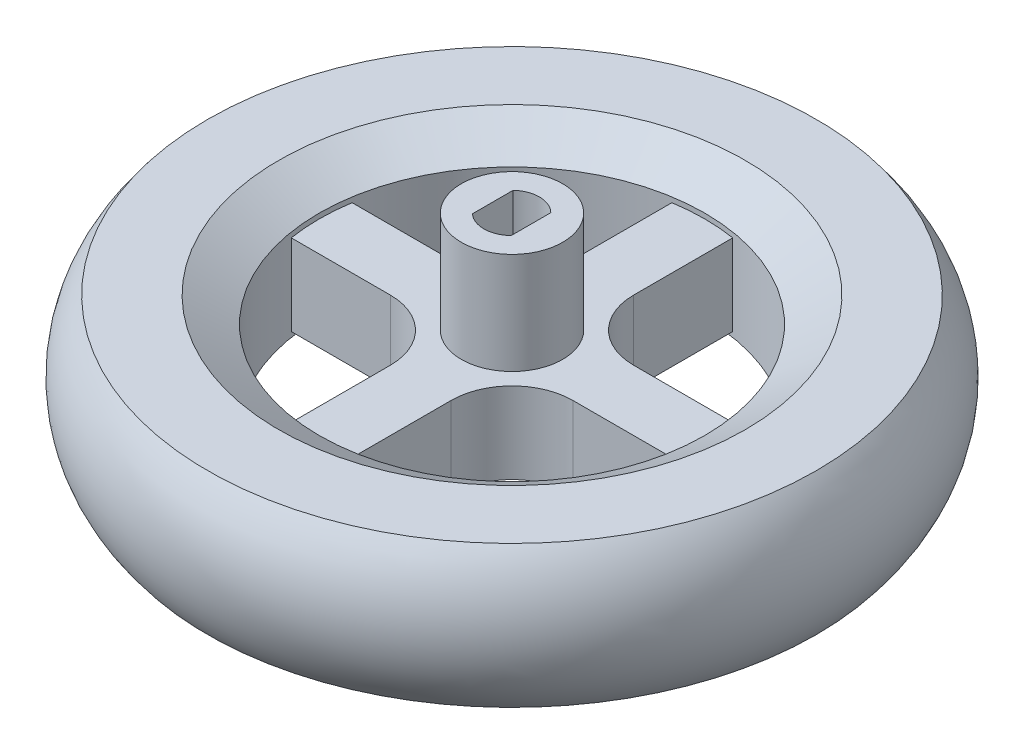
ISO-10303-21;
HEADER;
FILE_DESCRIPTION(('STEP AP214'),'2;1');
FILE_NAME('part.step','',(''),(''),'','','');
FILE_SCHEMA(('AUTOMOTIVE_DESIGN { 1 0 10303 214 1 1 1 1 }'));
ENDSEC;
DATA;
#1=APPLICATION_CONTEXT('core data for automotive mechanical design processes');
#2=APPLICATION_PROTOCOL_DEFINITION('international standard','automotive_design',2000,#1);
#3=PRODUCT_CONTEXT('',#1,'mechanical');
#4=PRODUCT('Part','Part','',(#3));
#5=PRODUCT_RELATED_PRODUCT_CATEGORY('part','',(#4));
#6=PRODUCT_DEFINITION_FORMATION('','',#4);
#7=PRODUCT_DEFINITION_CONTEXT('part definition',#1,'design');
#8=PRODUCT_DEFINITION('design','',#6,#7);
#9=PRODUCT_DEFINITION_SHAPE('','',#8);
#10=(LENGTH_UNIT() NAMED_UNIT(*) SI_UNIT(.MILLI.,.METRE.));
#11=(NAMED_UNIT(*) PLANE_ANGLE_UNIT() SI_UNIT($,.RADIAN.));
#12=(NAMED_UNIT(*) SI_UNIT($,.STERADIAN.) SOLID_ANGLE_UNIT());
#13=UNCERTAINTY_MEASURE_WITH_UNIT(LENGTH_MEASURE(1.E-05),#10,'distance_accuracy_value','');
#14=(GEOMETRIC_REPRESENTATION_CONTEXT(3) GLOBAL_UNCERTAINTY_ASSIGNED_CONTEXT((#13)) GLOBAL_UNIT_ASSIGNED_CONTEXT((#10,
#11,#12)) REPRESENTATION_CONTEXT('',''));
#15=CARTESIAN_POINT('',(0.,0.,0.));
#16=DIRECTION('',(0.,0.,1.));
#17=DIRECTION('',(1.,0.,0.));
#18=AXIS2_PLACEMENT_3D('',#15,#16,#17);
#19=CARTESIAN_POINT('',(0.,-7.,0.));
#20=DIRECTION('',(0.,-1.,0.));
#21=DIRECTION('',(1.,0.,0.));
#22=AXIS2_PLACEMENT_3D('',#19,#20,#21);
#23=CYLINDRICAL_SURFACE('',#22,19.);
#24=CARTESIAN_POINT('',(0.,-4.,0.));
#25=DIRECTION('',(0.,1.,0.));
#26=DIRECTION('',(-1.,0.,0.));
#27=AXIS2_PLACEMENT_3D('',#24,#25,#26);
#28=CIRCLE('',#27,19.);
#29=CARTESIAN_POINT('',(18.7616630392937,-4.,-3.));
#30=VERTEX_POINT('',#29);
#31=CARTESIAN_POINT('',(18.7616630392937,-4.,3.));
#32=VERTEX_POINT('',#31);
#33=EDGE_CURVE('E57',#30,#32,#28,.F.);
#34=ORIENTED_EDGE('',*,*,#33,.F.);
#35=DIRECTION('',(0.,-1.,0.));
#36=VECTOR('',#35,1.);
#37=CARTESIAN_POINT('',(18.7616630392937,-7.,-3.));
#38=LINE('',#37,#36);
#39=CARTESIAN_POINT('',(18.7616630392937,4.,-3.));
#40=VERTEX_POINT('',#39);
#41=EDGE_CURVE('E348',#30,#40,#38,.F.);
#42=ORIENTED_EDGE('',*,*,#41,.T.);
#43=CARTESIAN_POINT('',(0.,4.,0.));
#44=DIRECTION('',(0.,1.,0.));
#45=DIRECTION('',(-1.,0.,0.));
#46=AXIS2_PLACEMENT_3D('',#43,#44,#45);
#47=CIRCLE('',#46,19.);
#48=CARTESIAN_POINT('',(18.7616630392937,4.,3.));
#49=VERTEX_POINT('',#48);
#50=EDGE_CURVE('E349',#40,#49,#47,.F.);
#51=ORIENTED_EDGE('',*,*,#50,.T.);
#52=DIRECTION('',(0.,-1.,0.));
#53=VECTOR('',#52,1.);
#54=CARTESIAN_POINT('',(18.7616630392937,-7.,3.));
#55=LINE('',#54,#53);
#56=EDGE_CURVE('E345',#49,#32,#55,.T.);
#57=ORIENTED_EDGE('',*,*,#56,.T.);
#58=EDGE_LOOP('',(#34,#42,#51,#57));
#59=FACE_BOUND('',#58,.T.);
#60=CARTESIAN_POINT('',(-18.7616630392937,-4.,3.));
#61=VERTEX_POINT('',#60);
#62=CARTESIAN_POINT('',(-18.7616630392937,-4.,-3.));
#63=VERTEX_POINT('',#62);
#64=EDGE_CURVE('E58',#61,#63,#28,.F.);
#65=ORIENTED_EDGE('',*,*,#64,.F.);
#66=DIRECTION('',(0.,-1.,0.));
#67=VECTOR('',#66,1.);
#68=CARTESIAN_POINT('',(-18.7616630392937,-7.,3.));
#69=LINE('',#68,#67);
#70=CARTESIAN_POINT('',(-18.7616630392937,4.,3.));
#71=VERTEX_POINT('',#70);
#72=EDGE_CURVE('E335',#61,#71,#69,.F.);
#73=ORIENTED_EDGE('',*,*,#72,.T.);
#74=CARTESIAN_POINT('',(-18.7616630392937,4.,-3.));
#75=VERTEX_POINT('',#74);
#76=EDGE_CURVE('E327',#71,#75,#47,.F.);
#77=ORIENTED_EDGE('',*,*,#76,.T.);
#78=DIRECTION('',(0.,-1.,0.));
#79=VECTOR('',#78,1.);
#80=CARTESIAN_POINT('',(-18.7616630392937,-7.,-3.));
#81=LINE('',#80,#79);
#82=EDGE_CURVE('E330',#75,#63,#81,.T.);
#83=ORIENTED_EDGE('',*,*,#82,.T.);
#84=EDGE_LOOP('',(#65,#73,#77,#83));
#85=FACE_BOUND('',#84,.T.);
#86=CARTESIAN_POINT('',(0.,4.5,0.));
#87=DIRECTION('',(0.,-1.,0.));
#88=DIRECTION('',(1.,0.,0.));
#89=AXIS2_PLACEMENT_3D('',#86,#87,#88);
#90=CIRCLE('',#89,19.);
#91=CARTESIAN_POINT('',(19.,4.5,0.));
#92=VERTEX_POINT('',#91);
#93=EDGE_CURVE('E321',#92,#92,#90,.T.);
#94=ORIENTED_EDGE('',*,*,#93,.F.);
#95=EDGE_LOOP('',(#94));
#96=FACE_BOUND('',#95,.T.);
#97=CARTESIAN_POINT('',(0.,-4.5,0.));
#98=DIRECTION('',(0.,-1.,0.));
#99=DIRECTION('',(1.,0.,0.));
#100=AXIS2_PLACEMENT_3D('',#97,#98,#99);
#101=CIRCLE('',#100,19.);
#102=CARTESIAN_POINT('',(19.,-4.5,0.));
#103=VERTEX_POINT('',#102);
#104=EDGE_CURVE('E318',#103,#103,#101,.T.);
#105=ORIENTED_EDGE('',*,*,#104,.T.);
#106=EDGE_LOOP('',(#105));
#107=FACE_BOUND('',#106,.T.);
#108=CARTESIAN_POINT('',(3.,-4.,18.7616630392937));
#109=VERTEX_POINT('',#108);
#110=CARTESIAN_POINT('',(-3.,-4.,18.7616630392937));
#111=VERTEX_POINT('',#110);
#112=EDGE_CURVE('E338',#109,#111,#28,.F.);
#113=ORIENTED_EDGE('',*,*,#112,.F.);
#114=DIRECTION('',(0.,-1.,0.));
#115=VECTOR('',#114,1.);
#116=CARTESIAN_POINT('',(3.,-7.,18.7616630392937));
#117=LINE('',#116,#115);
#118=CARTESIAN_POINT('',(3.,4.,18.7616630392937));
#119=VERTEX_POINT('',#118);
#120=EDGE_CURVE('E342',#109,#119,#117,.F.);
#121=ORIENTED_EDGE('',*,*,#120,.T.);
#122=CARTESIAN_POINT('',(-3.,4.,18.7616630392937));
#123=VERTEX_POINT('',#122);
#124=EDGE_CURVE('E332',#119,#123,#47,.F.);
#125=ORIENTED_EDGE('',*,*,#124,.T.);
#126=DIRECTION('',(0.,-1.,0.));
#127=VECTOR('',#126,1.);
#128=CARTESIAN_POINT('',(-3.,-7.,18.7616630392937));
#129=LINE('',#128,#127);
#130=EDGE_CURVE('E339',#123,#111,#129,.T.);
#131=ORIENTED_EDGE('',*,*,#130,.T.);
#132=EDGE_LOOP('',(#113,#121,#125,#131));
#133=FACE_BOUND('',#132,.T.);
#134=CARTESIAN_POINT('',(-3.,-4.,-18.7616630392937));
#135=VERTEX_POINT('',#134);
#136=CARTESIAN_POINT('',(3.,-4.,-18.7616630392937));
#137=VERTEX_POINT('',#136);
#138=EDGE_CURVE('E11',#135,#137,#28,.F.);
#139=ORIENTED_EDGE('',*,*,#138,.F.);
#140=DIRECTION('',(0.,-1.,0.));
#141=VECTOR('',#140,1.);
#142=CARTESIAN_POINT('',(-3.,-7.,-18.7616630392937));
#143=LINE('',#142,#141);
#144=CARTESIAN_POINT('',(-3.,4.,-18.7616630392937));
#145=VERTEX_POINT('',#144);
#146=EDGE_CURVE('E351',#135,#145,#143,.F.);
#147=ORIENTED_EDGE('',*,*,#146,.T.);
#148=CARTESIAN_POINT('',(3.,4.,-18.7616630392937));
#149=VERTEX_POINT('',#148);
#150=EDGE_CURVE('E331',#145,#149,#47,.F.);
#151=ORIENTED_EDGE('',*,*,#150,.T.);
#152=DIRECTION('',(0.,-1.,0.));
#153=VECTOR('',#152,1.);
#154=CARTESIAN_POINT('',(3.,-7.,-18.7616630392937));
#155=LINE('',#154,#153);
#156=EDGE_CURVE('E51',#149,#137,#155,.T.);
#157=ORIENTED_EDGE('',*,*,#156,.T.);
#158=EDGE_LOOP('',(#139,#147,#151,#157));
#159=FACE_BOUND('',#158,.T.);
#160=ADVANCED_FACE('F47',(#59,#85,#96,#107,#133,#159),#23,.F.);
#161=CARTESIAN_POINT('',(-23.,7.00000000000001,0.));
#162=DIRECTION('',(0.,-1.,0.));
#163=DIRECTION('',(1.,0.,0.));
#164=AXIS2_PLACEMENT_3D('',#161,#162,#163);
#165=PLANE('',#164);
#166=CARTESIAN_POINT('',(0.,7.00000000000001,0.));
#167=DIRECTION('',(0.,-1.,0.));
#168=DIRECTION('',(1.,0.,0.));
#169=AXIS2_PLACEMENT_3D('',#166,#167,#168);
#170=CIRCLE('',#169,30.);
#171=CARTESIAN_POINT('',(30.,7.00000000000001,0.));
#172=VERTEX_POINT('',#171);
#173=EDGE_CURVE('E292',#172,#172,#170,.T.);
#174=ORIENTED_EDGE('',*,*,#173,.F.);
#175=EDGE_LOOP('',(#174));
#176=FACE_BOUND('',#175,.T.);
#177=CARTESIAN_POINT('',(0.,7.00000000000001,0.));
#178=DIRECTION('',(0.,-1.,0.));
#179=DIRECTION('',(1.,0.,0.));
#180=AXIS2_PLACEMENT_3D('',#177,#178,#179);
#181=CIRCLE('',#180,23.);
#182=CARTESIAN_POINT('',(23.,7.00000000000002,0.));
#183=VERTEX_POINT('',#182);
#184=EDGE_CURVE('E324',#183,#183,#181,.T.);
#185=ORIENTED_EDGE('',*,*,#184,.T.);
#186=EDGE_LOOP('',(#185));
#187=FACE_BOUND('',#186,.T.);
#188=ADVANCED_FACE('F49',(#176,#187),#165,.F.);
#189=CARTESIAN_POINT('',(0.,4.5,0.));
#190=DIRECTION('',(0.,1.,0.));
#191=DIRECTION('',(-1.,0.,0.));
#192=AXIS2_PLACEMENT_3D('',#189,#190,#191);
#193=CONICAL_SURFACE('',#192,19.,1.01219701145133);
#194=ORIENTED_EDGE('',*,*,#184,.F.);
#195=EDGE_LOOP('',(#194));
#196=FACE_BOUND('',#195,.T.);
#197=ORIENTED_EDGE('',*,*,#93,.T.);
#198=EDGE_LOOP('',(#197));
#199=FACE_BOUND('',#198,.T.);
#200=ADVANCED_FACE('F437',(#196,#199),#193,.F.);
#201=CARTESIAN_POINT('',(0.,-6.99999999999999,0.));
#202=DIRECTION('',(0.,-1.,0.));
#203=DIRECTION('',(1.,0.,0.));
#204=AXIS2_PLACEMENT_3D('',#201,#202,#203);
#205=CONICAL_SURFACE('',#204,23.,1.01219701145134);
#206=ORIENTED_EDGE('',*,*,#104,.F.);
#207=EDGE_LOOP('',(#206));
#208=FACE_BOUND('',#207,.T.);
#209=CARTESIAN_POINT('',(0.,-6.99999999999999,0.));
#210=DIRECTION('',(0.,-1.,0.));
#211=DIRECTION('',(1.,0.,0.));
#212=AXIS2_PLACEMENT_3D('',#209,#210,#211);
#213=CIRCLE('',#212,23.);
#214=CARTESIAN_POINT('',(23.,-6.99999999999998,0.));
#215=VERTEX_POINT('',#214);
#216=EDGE_CURVE('E315',#215,#215,#213,.T.);
#217=ORIENTED_EDGE('',*,*,#216,.T.);
#218=EDGE_LOOP('',(#217));
#219=FACE_BOUND('',#218,.T.);
#220=ADVANCED_FACE('F440',(#208,#219),#205,.F.);
#221=CARTESIAN_POINT('',(-23.,-6.99999999999999,0.));
#222=DIRECTION('',(0.,1.,0.));
#223=DIRECTION('',(-1.,0.,0.));
#224=AXIS2_PLACEMENT_3D('',#221,#222,#223);
#225=PLANE('',#224);
#226=ORIENTED_EDGE('',*,*,#216,.F.);
#227=EDGE_LOOP('',(#226));
#228=FACE_BOUND('',#227,.T.);
#229=CARTESIAN_POINT('',(0.,-6.99999999999998,0.));
#230=DIRECTION('',(0.,-1.,0.));
#231=DIRECTION('',(1.,0.,0.));
#232=AXIS2_PLACEMENT_3D('',#229,#230,#231);
#233=CIRCLE('',#232,30.);
#234=CARTESIAN_POINT('',(30.,-6.99999999999998,0.));
#235=VERTEX_POINT('',#234);
#236=EDGE_CURVE('E312',#235,#235,#233,.T.);
#237=ORIENTED_EDGE('',*,*,#236,.T.);
#238=EDGE_LOOP('',(#237));
#239=FACE_BOUND('',#238,.T.);
#240=ADVANCED_FACE('F447',(#228,#239),#225,.F.);
#241=CARTESIAN_POINT('',(0.,0.,0.));
#242=DIRECTION('',(0.,-1.,0.));
#243=DIRECTION('',(1.,0.,0.));
#244=AXIS2_PLACEMENT_3D('',#241,#242,#243);
#245=TOROIDAL_SURFACE('',#244,21.45,11.05);
#246=ORIENTED_EDGE('',*,*,#236,.F.);
#247=EDGE_LOOP('',(#246));
#248=FACE_BOUND('',#247,.T.);
#249=ORIENTED_EDGE('',*,*,#173,.T.);
#250=EDGE_LOOP('',(#249));
#251=FACE_BOUND('',#250,.T.);
#252=ADVANCED_FACE('F459',(#248,#251),#245,.T.);
#253=CARTESIAN_POINT('',(3.,-4.,-9.));
#254=DIRECTION('',(1.,0.,0.));
#255=DIRECTION('',(0.,1.,0.));
#256=AXIS2_PLACEMENT_3D('',#253,#254,#255);
#257=PLANE('',#256);
#258=ORIENTED_EDGE('',*,*,#156,.F.);
#259=DIRECTION('',(0.,0.,-1.));
#260=VECTOR('',#259,1.);
#261=CARTESIAN_POINT('',(3.,4.,-9.));
#262=LINE('',#261,#260);
#263=CARTESIAN_POINT('',(3.,4.,-9.));
#264=VERTEX_POINT('',#263);
#265=EDGE_CURVE('E73',#264,#149,#262,.T.);
#266=ORIENTED_EDGE('',*,*,#265,.F.);
#267=DIRECTION('',(0.,1.,0.));
#268=VECTOR('',#267,1.);
#269=CARTESIAN_POINT('',(3.,-4.,-9.));
#270=LINE('',#269,#268);
#271=CARTESIAN_POINT('',(3.,-4.,-9.));
#272=VERTEX_POINT('',#271);
#273=EDGE_CURVE('E290',#272,#264,#270,.T.);
#274=ORIENTED_EDGE('',*,*,#273,.F.);
#275=DIRECTION('',(0.,0.,-1.));
#276=VECTOR('',#275,1.);
#277=CARTESIAN_POINT('',(3.,-4.,-9.));
#278=LINE('',#277,#276);
#279=EDGE_CURVE('E257',#272,#137,#278,.T.);
#280=ORIENTED_EDGE('',*,*,#279,.T.);
#281=EDGE_LOOP('',(#258,#266,#274,#280));
#282=FACE_BOUND('',#281,.T.);
#283=ADVANCED_FACE('F395',(#282),#257,.T.);
#284=CARTESIAN_POINT('',(9.,-4.,-3.));
#285=DIRECTION('',(0.,0.,-1.));
#286=DIRECTION('',(-1.,0.,0.));
#287=AXIS2_PLACEMENT_3D('',#284,#285,#286);
#288=PLANE('',#287);
#289=ORIENTED_EDGE('',*,*,#41,.F.);
#290=DIRECTION('',(-1.,0.,0.));
#291=VECTOR('',#290,1.);
#292=CARTESIAN_POINT('',(9.,-4.,-3.));
#293=LINE('',#292,#291);
#294=CARTESIAN_POINT('',(9.,-4.,-3.));
#295=VERTEX_POINT('',#294);
#296=EDGE_CURVE('E284',#30,#295,#293,.T.);
#297=ORIENTED_EDGE('',*,*,#296,.T.);
#298=DIRECTION('',(0.,1.,0.));
#299=VECTOR('',#298,1.);
#300=CARTESIAN_POINT('',(9.,-4.,-3.));
#301=LINE('',#300,#299);
#302=CARTESIAN_POINT('',(9.,4.,-3.));
#303=VERTEX_POINT('',#302);
#304=EDGE_CURVE('E293',#295,#303,#301,.T.);
#305=ORIENTED_EDGE('',*,*,#304,.T.);
#306=DIRECTION('',(-1.,0.,0.));
#307=VECTOR('',#306,1.);
#308=CARTESIAN_POINT('',(9.,4.,-3.));
#309=LINE('',#308,#307);
#310=EDGE_CURVE('E253',#40,#303,#309,.T.);
#311=ORIENTED_EDGE('',*,*,#310,.F.);
#312=EDGE_LOOP('',(#289,#297,#305,#311));
#313=FACE_BOUND('',#312,.T.);
#314=ADVANCED_FACE('F389',(#313),#288,.T.);
#315=CARTESIAN_POINT('',(9.,-4.,3.));
#316=DIRECTION('',(0.,0.,1.));
#317=DIRECTION('',(1.,0.,0.));
#318=AXIS2_PLACEMENT_3D('',#315,#316,#317);
#319=PLANE('',#318);
#320=ORIENTED_EDGE('',*,*,#56,.F.);
#321=DIRECTION('',(1.,0.,0.));
#322=VECTOR('',#321,1.);
#323=CARTESIAN_POINT('',(9.,4.,3.));
#324=LINE('',#323,#322);
#325=CARTESIAN_POINT('',(9.,4.,3.));
#326=VERTEX_POINT('',#325);
#327=EDGE_CURVE('E251',#326,#49,#324,.T.);
#328=ORIENTED_EDGE('',*,*,#327,.F.);
#329=DIRECTION('',(0.,1.,0.));
#330=VECTOR('',#329,1.);
#331=CARTESIAN_POINT('',(9.,-4.,3.));
#332=LINE('',#331,#330);
#333=CARTESIAN_POINT('',(9.,-4.,3.));
#334=VERTEX_POINT('',#333);
#335=EDGE_CURVE('E296',#334,#326,#332,.T.);
#336=ORIENTED_EDGE('',*,*,#335,.F.);
#337=DIRECTION('',(1.,0.,0.));
#338=VECTOR('',#337,1.);
#339=CARTESIAN_POINT('',(9.,-4.,3.));
#340=LINE('',#339,#338);
#341=EDGE_CURVE('E281',#334,#32,#340,.T.);
#342=ORIENTED_EDGE('',*,*,#341,.T.);
#343=EDGE_LOOP('',(#320,#328,#336,#342));
#344=FACE_BOUND('',#343,.T.);
#345=ADVANCED_FACE('F377',(#344),#319,.T.);
#346=CARTESIAN_POINT('',(3.,-4.,25.));
#347=DIRECTION('',(1.,0.,0.));
#348=DIRECTION('',(0.,1.,0.));
#349=AXIS2_PLACEMENT_3D('',#346,#347,#348);
#350=PLANE('',#349);
#351=ORIENTED_EDGE('',*,*,#120,.F.);
#352=DIRECTION('',(0.,0.,-1.));
#353=VECTOR('',#352,1.);
#354=CARTESIAN_POINT('',(3.,-4.,25.));
#355=LINE('',#354,#353);
#356=CARTESIAN_POINT('',(3.,-4.,9.));
#357=VERTEX_POINT('',#356);
#358=EDGE_CURVE('E276',#109,#357,#355,.T.);
#359=ORIENTED_EDGE('',*,*,#358,.T.);
#360=DIRECTION('',(0.,1.,0.));
#361=VECTOR('',#360,1.);
#362=CARTESIAN_POINT('',(3.,-4.,9.));
#363=LINE('',#362,#361);
#364=CARTESIAN_POINT('',(3.,4.,9.));
#365=VERTEX_POINT('',#364);
#366=EDGE_CURVE('E298',#357,#365,#363,.T.);
#367=ORIENTED_EDGE('',*,*,#366,.T.);
#368=DIRECTION('',(0.,0.,-1.));
#369=VECTOR('',#368,1.);
#370=CARTESIAN_POINT('',(3.,4.,25.));
#371=LINE('',#370,#369);
#372=EDGE_CURVE('E246',#119,#365,#371,.T.);
#373=ORIENTED_EDGE('',*,*,#372,.F.);
#374=EDGE_LOOP('',(#351,#359,#367,#373));
#375=FACE_BOUND('',#374,.T.);
#376=ADVANCED_FACE('F367',(#375),#350,.T.);
#377=CARTESIAN_POINT('',(-3.,-4.,25.));
#378=DIRECTION('',(-1.,0.,0.));
#379=DIRECTION('',(0.,-1.,0.));
#380=AXIS2_PLACEMENT_3D('',#377,#378,#379);
#381=PLANE('',#380);
#382=ORIENTED_EDGE('',*,*,#130,.F.);
#383=DIRECTION('',(0.,0.,1.));
#384=VECTOR('',#383,1.);
#385=CARTESIAN_POINT('',(-3.,4.,25.));
#386=LINE('',#385,#384);
#387=CARTESIAN_POINT('',(-3.,4.,9.));
#388=VERTEX_POINT('',#387);
#389=EDGE_CURVE('E244',#388,#123,#386,.T.);
#390=ORIENTED_EDGE('',*,*,#389,.F.);
#391=DIRECTION('',(0.,1.,0.));
#392=VECTOR('',#391,1.);
#393=CARTESIAN_POINT('',(-3.,-4.,9.));
#394=LINE('',#393,#392);
#395=CARTESIAN_POINT('',(-3.,-4.,9.));
#396=VERTEX_POINT('',#395);
#397=EDGE_CURVE('E301',#396,#388,#394,.T.);
#398=ORIENTED_EDGE('',*,*,#397,.F.);
#399=DIRECTION('',(0.,0.,1.));
#400=VECTOR('',#399,1.);
#401=CARTESIAN_POINT('',(-3.,-4.,25.));
#402=LINE('',#401,#400);
#403=EDGE_CURVE('E273',#396,#111,#402,.T.);
#404=ORIENTED_EDGE('',*,*,#403,.T.);
#405=EDGE_LOOP('',(#382,#390,#398,#404));
#406=FACE_BOUND('',#405,.T.);
#407=ADVANCED_FACE('F421',(#406),#381,.T.);
#408=CARTESIAN_POINT('',(-25.,-4.,3.));
#409=DIRECTION('',(0.,0.,1.));
#410=DIRECTION('',(1.,0.,0.));
#411=AXIS2_PLACEMENT_3D('',#408,#409,#410);
#412=PLANE('',#411);
#413=ORIENTED_EDGE('',*,*,#72,.F.);
#414=DIRECTION('',(1.,0.,0.));
#415=VECTOR('',#414,1.);
#416=CARTESIAN_POINT('',(-25.,-4.,3.));
#417=LINE('',#416,#415);
#418=CARTESIAN_POINT('',(-9.,-4.,3.));
#419=VERTEX_POINT('',#418);
#420=EDGE_CURVE('E268',#61,#419,#417,.T.);
#421=ORIENTED_EDGE('',*,*,#420,.T.);
#422=DIRECTION('',(0.,1.,0.));
#423=VECTOR('',#422,1.);
#424=CARTESIAN_POINT('',(-9.,-4.,3.));
#425=LINE('',#424,#423);
#426=CARTESIAN_POINT('',(-9.,4.,3.));
#427=VERTEX_POINT('',#426);
#428=EDGE_CURVE('E303',#419,#427,#425,.T.);
#429=ORIENTED_EDGE('',*,*,#428,.T.);
#430=DIRECTION('',(1.,0.,0.));
#431=VECTOR('',#430,1.);
#432=CARTESIAN_POINT('',(-25.,4.,3.));
#433=LINE('',#432,#431);
#434=EDGE_CURVE('E239',#71,#427,#433,.T.);
#435=ORIENTED_EDGE('',*,*,#434,.F.);
#436=EDGE_LOOP('',(#413,#421,#429,#435));
#437=FACE_BOUND('',#436,.T.);
#438=ADVANCED_FACE('F413',(#437),#412,.T.);
#439=CARTESIAN_POINT('',(-25.,-4.,-3.));
#440=DIRECTION('',(0.,0.,-1.));
#441=DIRECTION('',(-1.,0.,0.));
#442=AXIS2_PLACEMENT_3D('',#439,#440,#441);
#443=PLANE('',#442);
#444=ORIENTED_EDGE('',*,*,#82,.F.);
#445=DIRECTION('',(-1.,0.,0.));
#446=VECTOR('',#445,1.);
#447=CARTESIAN_POINT('',(-25.,4.,-3.));
#448=LINE('',#447,#446);
#449=CARTESIAN_POINT('',(-9.,4.,-3.));
#450=VERTEX_POINT('',#449);
#451=EDGE_CURVE('E237',#450,#75,#448,.T.);
#452=ORIENTED_EDGE('',*,*,#451,.F.);
#453=DIRECTION('',(0.,1.,0.));
#454=VECTOR('',#453,1.);
#455=CARTESIAN_POINT('',(-9.,-4.,-3.));
#456=LINE('',#455,#454);
#457=CARTESIAN_POINT('',(-9.,-4.,-3.));
#458=VERTEX_POINT('',#457);
#459=EDGE_CURVE('E306',#458,#450,#456,.T.);
#460=ORIENTED_EDGE('',*,*,#459,.F.);
#461=DIRECTION('',(-1.,0.,0.));
#462=VECTOR('',#461,1.);
#463=CARTESIAN_POINT('',(-25.,-4.,-3.));
#464=LINE('',#463,#462);
#465=EDGE_CURVE('E265',#458,#63,#464,.T.);
#466=ORIENTED_EDGE('',*,*,#465,.T.);
#467=EDGE_LOOP('',(#444,#452,#460,#466));
#468=FACE_BOUND('',#467,.T.);
#469=ADVANCED_FACE('F408',(#468),#443,.T.);
#470=CARTESIAN_POINT('',(-3.,-4.,-9.));
#471=DIRECTION('',(-1.,0.,0.));
#472=DIRECTION('',(0.,-1.,0.));
#473=AXIS2_PLACEMENT_3D('',#470,#471,#472);
#474=PLANE('',#473);
#475=ORIENTED_EDGE('',*,*,#146,.F.);
#476=DIRECTION('',(0.,0.,1.));
#477=VECTOR('',#476,1.);
#478=CARTESIAN_POINT('',(-3.,-4.,-9.));
#479=LINE('',#478,#477);
#480=CARTESIAN_POINT('',(-3.,-4.,-9.));
#481=VERTEX_POINT('',#480);
#482=EDGE_CURVE('E260',#135,#481,#479,.T.);
#483=ORIENTED_EDGE('',*,*,#482,.T.);
#484=DIRECTION('',(0.,1.,0.));
#485=VECTOR('',#484,1.);
#486=CARTESIAN_POINT('',(-3.,-4.,-9.));
#487=LINE('',#486,#485);
#488=CARTESIAN_POINT('',(-3.,4.,-9.));
#489=VERTEX_POINT('',#488);
#490=EDGE_CURVE('E289',#481,#489,#487,.T.);
#491=ORIENTED_EDGE('',*,*,#490,.T.);
#492=DIRECTION('',(0.,0.,1.));
#493=VECTOR('',#492,1.);
#494=CARTESIAN_POINT('',(-3.,4.,-9.));
#495=LINE('',#494,#493);
#496=EDGE_CURVE('E232',#145,#489,#495,.T.);
#497=ORIENTED_EDGE('',*,*,#496,.F.);
#498=EDGE_LOOP('',(#475,#483,#491,#497));
#499=FACE_BOUND('',#498,.T.);
#500=ADVANCED_FACE('F400',(#499),#474,.T.);
#501=CARTESIAN_POINT('',(-9.,-4.,-9.));
#502=DIRECTION('',(0.,1.,0.));
#503=DIRECTION('',(-1.,0.,0.));
#504=AXIS2_PLACEMENT_3D('',#501,#502,#503);
#505=PLANE('',#504);
#506=ORIENTED_EDGE('',*,*,#482,.F.);
#507=ORIENTED_EDGE('',*,*,#138,.T.);
#508=ORIENTED_EDGE('',*,*,#279,.F.);
#509=CARTESIAN_POINT('',(9.,-4.,-9.));
#510=DIRECTION('',(0.,-1.,0.));
#511=DIRECTION('',(1.,0.,0.));
#512=AXIS2_PLACEMENT_3D('',#509,#510,#511);
#513=CIRCLE('',#512,6.);
#514=EDGE_CURVE('E286',#295,#272,#513,.T.);
#515=ORIENTED_EDGE('',*,*,#514,.F.);
#516=ORIENTED_EDGE('',*,*,#296,.F.);
#517=ORIENTED_EDGE('',*,*,#33,.T.);
#518=ORIENTED_EDGE('',*,*,#341,.F.);
#519=CARTESIAN_POINT('',(9.,-4.,9.));
#520=DIRECTION('',(0.,-1.,0.));
#521=DIRECTION('',(1.,0.,0.));
#522=AXIS2_PLACEMENT_3D('',#519,#520,#521);
#523=CIRCLE('',#522,6.);
#524=EDGE_CURVE('E278',#357,#334,#523,.T.);
#525=ORIENTED_EDGE('',*,*,#524,.F.);
#526=ORIENTED_EDGE('',*,*,#358,.F.);
#527=ORIENTED_EDGE('',*,*,#112,.T.);
#528=ORIENTED_EDGE('',*,*,#403,.F.);
#529=CARTESIAN_POINT('',(-9.,-4.,9.));
#530=DIRECTION('',(0.,-1.,0.));
#531=DIRECTION('',(1.,0.,0.));
#532=AXIS2_PLACEMENT_3D('',#529,#530,#531);
#533=CIRCLE('',#532,6.);
#534=EDGE_CURVE('E270',#419,#396,#533,.T.);
#535=ORIENTED_EDGE('',*,*,#534,.F.);
#536=ORIENTED_EDGE('',*,*,#420,.F.);
#537=ORIENTED_EDGE('',*,*,#64,.T.);
#538=ORIENTED_EDGE('',*,*,#465,.F.);
#539=CARTESIAN_POINT('',(-9.,-4.,-9.));
#540=DIRECTION('',(0.,-1.,0.));
#541=DIRECTION('',(-1.,0.,0.));
#542=AXIS2_PLACEMENT_3D('',#539,#540,#541);
#543=CIRCLE('',#542,6.);
#544=EDGE_CURVE('E262',#481,#458,#543,.T.);
#545=ORIENTED_EDGE('',*,*,#544,.F.);
#546=EDGE_LOOP('',(#506,#507,#508,#515,#516,#517,#518,#525,#526,#527,#528,#535,#536,#537,#538,#545));
#547=FACE_BOUND('',#546,.T.);
#548=ADVANCED_FACE('F384',(#547),#505,.F.);
#549=CARTESIAN_POINT('',(-9.,4.,-9.));
#550=DIRECTION('',(0.,1.,0.));
#551=DIRECTION('',(-1.,0.,0.));
#552=AXIS2_PLACEMENT_3D('',#549,#550,#551);
#553=PLANE('',#552);
#554=CARTESIAN_POINT('',(0.,4.,0.));
#555=DIRECTION('',(0.,1.,0.));
#556=DIRECTION('',(-1.,0.,0.));
#557=AXIS2_PLACEMENT_3D('',#554,#555,#556);
#558=CIRCLE('',#557,5.);
#559=CARTESIAN_POINT('',(-5.,4.,0.));
#560=VERTEX_POINT('',#559);
#561=EDGE_CURVE('E222',#560,#560,#558,.T.);
#562=ORIENTED_EDGE('',*,*,#561,.F.);
#563=EDGE_LOOP('',(#562));
#564=FACE_BOUND('',#563,.T.);
#565=ORIENTED_EDGE('',*,*,#150,.F.);
#566=ORIENTED_EDGE('',*,*,#496,.T.);
#567=CARTESIAN_POINT('',(-9.,4.,-9.));
#568=DIRECTION('',(0.,-1.,0.));
#569=DIRECTION('',(-1.,0.,0.));
#570=AXIS2_PLACEMENT_3D('',#567,#568,#569);
#571=CIRCLE('',#570,6.);
#572=EDGE_CURVE('E234',#489,#450,#571,.T.);
#573=ORIENTED_EDGE('',*,*,#572,.T.);
#574=ORIENTED_EDGE('',*,*,#451,.T.);
#575=ORIENTED_EDGE('',*,*,#76,.F.);
#576=ORIENTED_EDGE('',*,*,#434,.T.);
#577=CARTESIAN_POINT('',(-9.,4.,9.));
#578=DIRECTION('',(0.,-1.,0.));
#579=DIRECTION('',(1.,0.,0.));
#580=AXIS2_PLACEMENT_3D('',#577,#578,#579);
#581=CIRCLE('',#580,6.);
#582=EDGE_CURVE('E241',#427,#388,#581,.T.);
#583=ORIENTED_EDGE('',*,*,#582,.T.);
#584=ORIENTED_EDGE('',*,*,#389,.T.);
#585=ORIENTED_EDGE('',*,*,#124,.F.);
#586=ORIENTED_EDGE('',*,*,#372,.T.);
#587=CARTESIAN_POINT('',(9.,4.,9.));
#588=DIRECTION('',(0.,-1.,0.));
#589=DIRECTION('',(1.,0.,0.));
#590=AXIS2_PLACEMENT_3D('',#587,#588,#589);
#591=CIRCLE('',#590,6.);
#592=EDGE_CURVE('E248',#365,#326,#591,.T.);
#593=ORIENTED_EDGE('',*,*,#592,.T.);
#594=ORIENTED_EDGE('',*,*,#327,.T.);
#595=ORIENTED_EDGE('',*,*,#50,.F.);
#596=ORIENTED_EDGE('',*,*,#310,.T.);
#597=CARTESIAN_POINT('',(9.,4.,-9.));
#598=DIRECTION('',(0.,-1.,0.));
#599=DIRECTION('',(1.,0.,0.));
#600=AXIS2_PLACEMENT_3D('',#597,#598,#599);
#601=CIRCLE('',#600,6.);
#602=EDGE_CURVE('E255',#303,#264,#601,.T.);
#603=ORIENTED_EDGE('',*,*,#602,.T.);
#604=ORIENTED_EDGE('',*,*,#265,.T.);
#605=EDGE_LOOP('',(#565,#566,#573,#574,#575,#576,#583,#584,#585,#586,#593,#594,#595,#596,#603,#604));
#606=FACE_BOUND('',#605,.T.);
#607=ADVANCED_FACE('F364',(#564,#606),#553,.T.);
#608=CARTESIAN_POINT('',(9.,-4.,-9.));
#609=DIRECTION('',(0.,1.,0.));
#610=DIRECTION('',(-1.,0.,0.));
#611=AXIS2_PLACEMENT_3D('',#608,#609,#610);
#612=CYLINDRICAL_SURFACE('',#611,6.);
#613=ORIENTED_EDGE('',*,*,#273,.T.);
#614=ORIENTED_EDGE('',*,*,#602,.F.);
#615=ORIENTED_EDGE('',*,*,#304,.F.);
#616=ORIENTED_EDGE('',*,*,#514,.T.);
#617=EDGE_LOOP('',(#613,#614,#615,#616));
#618=FACE_BOUND('',#617,.T.);
#619=ADVANCED_FACE('F393',(#618),#612,.F.);
#620=CARTESIAN_POINT('',(9.,-4.,9.));
#621=DIRECTION('',(0.,1.,0.));
#622=DIRECTION('',(-1.,0.,0.));
#623=AXIS2_PLACEMENT_3D('',#620,#621,#622);
#624=CYLINDRICAL_SURFACE('',#623,6.);
#625=ORIENTED_EDGE('',*,*,#335,.T.);
#626=ORIENTED_EDGE('',*,*,#592,.F.);
#627=ORIENTED_EDGE('',*,*,#366,.F.);
#628=ORIENTED_EDGE('',*,*,#524,.T.);
#629=EDGE_LOOP('',(#625,#626,#627,#628));
#630=FACE_BOUND('',#629,.T.);
#631=ADVANCED_FACE('F373',(#630),#624,.F.);
#632=CARTESIAN_POINT('',(-9.,-4.,9.));
#633=DIRECTION('',(0.,1.,0.));
#634=DIRECTION('',(-1.,0.,0.));
#635=AXIS2_PLACEMENT_3D('',#632,#633,#634);
#636=CYLINDRICAL_SURFACE('',#635,6.);
#637=ORIENTED_EDGE('',*,*,#397,.T.);
#638=ORIENTED_EDGE('',*,*,#582,.F.);
#639=ORIENTED_EDGE('',*,*,#428,.F.);
#640=ORIENTED_EDGE('',*,*,#534,.T.);
#641=EDGE_LOOP('',(#637,#638,#639,#640));
#642=FACE_BOUND('',#641,.T.);
#643=ADVANCED_FACE('F419',(#642),#636,.F.);
#644=CARTESIAN_POINT('',(-9.,-4.,-9.));
#645=DIRECTION('',(0.,1.,0.));
#646=DIRECTION('',(-1.,0.,0.));
#647=AXIS2_PLACEMENT_3D('',#644,#645,#646);
#648=CYLINDRICAL_SURFACE('',#647,6.);
#649=ORIENTED_EDGE('',*,*,#459,.T.);
#650=ORIENTED_EDGE('',*,*,#572,.F.);
#651=ORIENTED_EDGE('',*,*,#490,.F.);
#652=ORIENTED_EDGE('',*,*,#544,.T.);
#653=EDGE_LOOP('',(#649,#650,#651,#652));
#654=FACE_BOUND('',#653,.T.);
#655=ADVANCED_FACE('F404',(#654),#648,.F.);
#656=CARTESIAN_POINT('',(0.,14.,0.));
#657=DIRECTION('',(0.,-1.,0.));
#658=DIRECTION('',(1.,0.,0.));
#659=AXIS2_PLACEMENT_3D('',#656,#657,#658);
#660=CYLINDRICAL_SURFACE('',#659,5.);
#661=CARTESIAN_POINT('',(0.,14.,0.));
#662=DIRECTION('',(0.,1.,0.));
#663=DIRECTION('',(-1.,0.,0.));
#664=AXIS2_PLACEMENT_3D('',#661,#662,#663);
#665=CIRCLE('',#664,5.);
#666=CARTESIAN_POINT('',(-5.,14.,0.));
#667=VERTEX_POINT('',#666);
#668=EDGE_CURVE('E226',#667,#667,#665,.T.);
#669=ORIENTED_EDGE('',*,*,#668,.F.);
#670=EDGE_LOOP('',(#669));
#671=FACE_BOUND('',#670,.T.);
#672=ORIENTED_EDGE('',*,*,#561,.T.);
#673=EDGE_LOOP('',(#672));
#674=FACE_BOUND('',#673,.T.);
#675=ADVANCED_FACE('F476',(#671,#674),#660,.T.);
#676=CARTESIAN_POINT('',(0.,14.,0.));
#677=DIRECTION('',(0.,1.,0.));
#678=DIRECTION('',(-1.,0.,0.));
#679=AXIS2_PLACEMENT_3D('',#676,#677,#678);
#680=PLANE('',#679);
#681=CARTESIAN_POINT('',(-0.029933724389307,14.,0.00751666818790805));
#682=DIRECTION('',(0.,1.,0.));
#683=DIRECTION('',(-1.,0.,0.));
#684=AXIS2_PLACEMENT_3D('',#681,#682,#683);
#685=CIRCLE('',#684,2.735);
#686=CARTESIAN_POINT('',(-1.885,14.,2.01723160147866));
#687=VERTEX_POINT('',#686);
#688=CARTESIAN_POINT('',(1.885,14.,1.96027211401222));
#689=VERTEX_POINT('',#688);
#690=EDGE_CURVE('E65',#687,#689,#685,.T.);
#691=ORIENTED_EDGE('',*,*,#690,.F.);
#692=DIRECTION('',(0.,0.,1.));
#693=VECTOR('',#692,1.);
#694=CARTESIAN_POINT('',(-1.885,14.,2.01723160147866));
#695=LINE('',#694,#693);
#696=CARTESIAN_POINT('',(-1.885,14.,-2.00219826510285));
#697=VERTEX_POINT('',#696);
#698=EDGE_CURVE('E207',#697,#687,#695,.T.);
#699=ORIENTED_EDGE('',*,*,#698,.F.);
#700=CARTESIAN_POINT('',(-0.029933724389307,14.,0.00751666818790805));
#701=DIRECTION('',(0.,1.,0.));
#702=DIRECTION('',(-1.,0.,0.));
#703=AXIS2_PLACEMENT_3D('',#700,#701,#702);
#704=CIRCLE('',#703,2.735);
#705=CARTESIAN_POINT('',(1.885,14.,-1.9452387776364));
#706=VERTEX_POINT('',#705);
#707=EDGE_CURVE('E210',#706,#697,#704,.T.);
#708=ORIENTED_EDGE('',*,*,#707,.F.);
#709=DIRECTION('',(0.,0.,-1.));
#710=VECTOR('',#709,1.);
#711=CARTESIAN_POINT('',(1.885,14.,1.96027211401222));
#712=LINE('',#711,#710);
#713=EDGE_CURVE('E216',#689,#706,#712,.T.);
#714=ORIENTED_EDGE('',*,*,#713,.F.);
#715=EDGE_LOOP('',(#691,#699,#708,#714));
#716=FACE_BOUND('',#715,.T.);
#717=ORIENTED_EDGE('',*,*,#668,.T.);
#718=EDGE_LOOP('',(#717));
#719=FACE_BOUND('',#718,.T.);
#720=ADVANCED_FACE('F499',(#716,#719),#680,.T.);
#721=CARTESIAN_POINT('',(-0.0299337243893053,5.,0.00751666818790805));
#722=DIRECTION('',(0.,1.,0.));
#723=DIRECTION('',(-1.,0.,0.));
#724=AXIS2_PLACEMENT_3D('',#721,#722,#723);
#725=CYLINDRICAL_SURFACE('',#724,2.735);
#726=ORIENTED_EDGE('',*,*,#690,.T.);
#727=DIRECTION('',(0.,1.,0.));
#728=VECTOR('',#727,1.);
#729=CARTESIAN_POINT('',(1.885,5.,1.96027211401222));
#730=LINE('',#729,#728);
#731=CARTESIAN_POINT('',(1.885,5.,1.96027211401222));
#732=VERTEX_POINT('',#731);
#733=EDGE_CURVE('E185',#732,#689,#730,.T.);
#734=ORIENTED_EDGE('',*,*,#733,.F.);
#735=CARTESIAN_POINT('',(-0.0299337243893053,5.,0.00751666818790805));
#736=DIRECTION('',(0.,1.,0.));
#737=DIRECTION('',(-1.,0.,0.));
#738=AXIS2_PLACEMENT_3D('',#735,#736,#737);
#739=CIRCLE('',#738,2.735);
#740=CARTESIAN_POINT('',(-1.885,5.,2.01723160147866));
#741=VERTEX_POINT('',#740);
#742=EDGE_CURVE('E189',#741,#732,#739,.T.);
#743=ORIENTED_EDGE('',*,*,#742,.F.);
#744=DIRECTION('',(0.,1.,0.));
#745=VECTOR('',#744,1.);
#746=CARTESIAN_POINT('',(-1.885,5.,2.01723160147866));
#747=LINE('',#746,#745);
#748=EDGE_CURVE('E220',#741,#687,#747,.T.);
#749=ORIENTED_EDGE('',*,*,#748,.T.);
#750=EDGE_LOOP('',(#726,#734,#743,#749));
#751=FACE_BOUND('',#750,.T.);
#752=ADVANCED_FACE('F187',(#751),#725,.F.);
#753=CARTESIAN_POINT('',(-1.885,5.,2.01723160147866));
#754=DIRECTION('',(-1.,0.,0.));
#755=DIRECTION('',(0.,-1.,0.));
#756=AXIS2_PLACEMENT_3D('',#753,#754,#755);
#757=PLANE('',#756);
#758=ORIENTED_EDGE('',*,*,#698,.T.);
#759=ORIENTED_EDGE('',*,*,#748,.F.);
#760=DIRECTION('',(0.,0.,1.));
#761=VECTOR('',#760,1.);
#762=CARTESIAN_POINT('',(-1.885,5.,2.01723160147866));
#763=LINE('',#762,#761);
#764=CARTESIAN_POINT('',(-1.885,5.,-2.00219826510285));
#765=VERTEX_POINT('',#764);
#766=EDGE_CURVE('E195',#765,#741,#763,.T.);
#767=ORIENTED_EDGE('',*,*,#766,.F.);
#768=DIRECTION('',(0.,1.,0.));
#769=VECTOR('',#768,1.);
#770=CARTESIAN_POINT('',(-1.885,5.,-2.00219826510285));
#771=LINE('',#770,#769);
#772=EDGE_CURVE('E223',#765,#697,#771,.T.);
#773=ORIENTED_EDGE('',*,*,#772,.T.);
#774=EDGE_LOOP('',(#758,#759,#767,#773));
#775=FACE_BOUND('',#774,.T.);
#776=ADVANCED_FACE('F506',(#775),#757,.F.);
#777=CARTESIAN_POINT('',(-0.0299337243893053,5.,0.00751666818790805));
#778=DIRECTION('',(0.,1.,0.));
#779=DIRECTION('',(-1.,0.,0.));
#780=AXIS2_PLACEMENT_3D('',#777,#778,#779);
#781=CYLINDRICAL_SURFACE('',#780,2.735);
#782=ORIENTED_EDGE('',*,*,#707,.T.);
#783=ORIENTED_EDGE('',*,*,#772,.F.);
#784=CARTESIAN_POINT('',(-0.0299337243893053,5.,0.00751666818790805));
#785=DIRECTION('',(0.,1.,0.));
#786=DIRECTION('',(-1.,0.,0.));
#787=AXIS2_PLACEMENT_3D('',#784,#785,#786);
#788=CIRCLE('',#787,2.735);
#789=CARTESIAN_POINT('',(1.885,5.,-1.9452387776364));
#790=VERTEX_POINT('',#789);
#791=EDGE_CURVE('E203',#790,#765,#788,.T.);
#792=ORIENTED_EDGE('',*,*,#791,.F.);
#793=DIRECTION('',(0.,1.,0.));
#794=VECTOR('',#793,1.);
#795=CARTESIAN_POINT('',(1.885,5.,-1.9452387776364));
#796=LINE('',#795,#794);
#797=EDGE_CURVE('E194',#790,#706,#796,.T.);
#798=ORIENTED_EDGE('',*,*,#797,.T.);
#799=EDGE_LOOP('',(#782,#783,#792,#798));
#800=FACE_BOUND('',#799,.T.);
#801=ADVANCED_FACE('F509',(#800),#781,.F.);
#802=CARTESIAN_POINT('',(1.885,5.,1.96027211401222));
#803=DIRECTION('',(1.,0.,0.));
#804=DIRECTION('',(0.,1.,0.));
#805=AXIS2_PLACEMENT_3D('',#802,#803,#804);
#806=PLANE('',#805);
#807=ORIENTED_EDGE('',*,*,#713,.T.);
#808=ORIENTED_EDGE('',*,*,#797,.F.);
#809=DIRECTION('',(0.,0.,-1.));
#810=VECTOR('',#809,1.);
#811=CARTESIAN_POINT('',(1.885,5.,1.96027211401222));
#812=LINE('',#811,#810);
#813=EDGE_CURVE('E198',#732,#790,#812,.T.);
#814=ORIENTED_EDGE('',*,*,#813,.F.);
#815=ORIENTED_EDGE('',*,*,#733,.T.);
#816=EDGE_LOOP('',(#807,#808,#814,#815));
#817=FACE_BOUND('',#816,.T.);
#818=ADVANCED_FACE('F199',(#817),#806,.F.);
#819=CARTESIAN_POINT('',(-0.0299337243893053,5.,0.00751666818790805));
#820=DIRECTION('',(0.,1.,0.));
#821=DIRECTION('',(-1.,0.,0.));
#822=AXIS2_PLACEMENT_3D('',#819,#820,#821);
#823=PLANE('',#822);
#824=ORIENTED_EDGE('',*,*,#742,.T.);
#825=ORIENTED_EDGE('',*,*,#813,.T.);
#826=ORIENTED_EDGE('',*,*,#791,.T.);
#827=ORIENTED_EDGE('',*,*,#766,.T.);
#828=EDGE_LOOP('',(#824,#825,#826,#827));
#829=FACE_BOUND('',#828,.T.);
#830=ADVANCED_FACE('F205',(#829),#823,.T.);
#831=CLOSED_SHELL('',(#160,#188,#200,#220,#240,#252,#283,#314,#345,#376,#407,#438,#469,#500,
#548,#607,#619,#631,#643,#655,#675,#720,#752,#776,#801,#818,#830));
#832=MANIFOLD_SOLID_BREP('B2',#831);
#833=ADVANCED_BREP_SHAPE_REPRESENTATION('',(#18,#832),#14);
#834=SHAPE_DEFINITION_REPRESENTATION(#9,#833);
ENDSEC;
END-ISO-10303-21;
